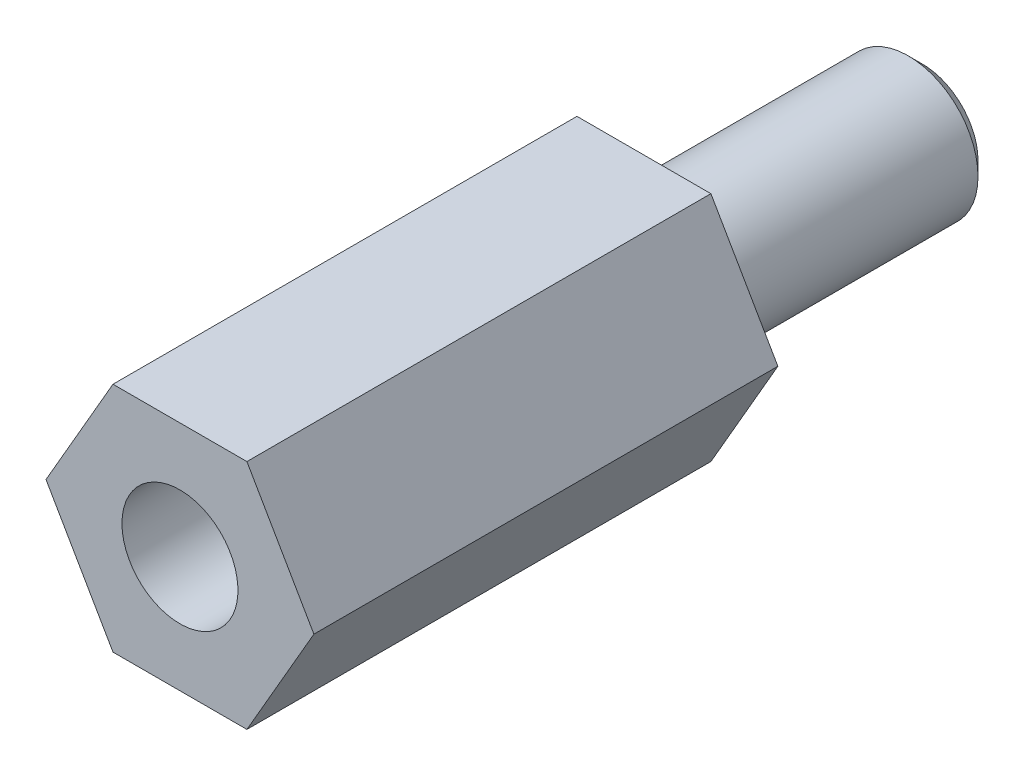
ISO-10303-21;
HEADER;
FILE_DESCRIPTION(('STEP AP214'),'2;1');
FILE_NAME('part.step','',(''),(''),'','','');
FILE_SCHEMA(('AUTOMOTIVE_DESIGN { 1 0 10303 214 1 1 1 1 }'));
ENDSEC;
DATA;
#1=APPLICATION_CONTEXT('core data for automotive mechanical design processes');
#2=APPLICATION_PROTOCOL_DEFINITION('international standard','automotive_design',2000,#1);
#3=PRODUCT_CONTEXT('',#1,'mechanical');
#4=PRODUCT('Part','Part','',(#3));
#5=PRODUCT_RELATED_PRODUCT_CATEGORY('part','',(#4));
#6=PRODUCT_DEFINITION_FORMATION('','',#4);
#7=PRODUCT_DEFINITION_CONTEXT('part definition',#1,'design');
#8=PRODUCT_DEFINITION('design','',#6,#7);
#9=PRODUCT_DEFINITION_SHAPE('','',#8);
#10=(LENGTH_UNIT() NAMED_UNIT(*) SI_UNIT(.MILLI.,.METRE.));
#11=(NAMED_UNIT(*) PLANE_ANGLE_UNIT() SI_UNIT($,.RADIAN.));
#12=(NAMED_UNIT(*) SI_UNIT($,.STERADIAN.) SOLID_ANGLE_UNIT());
#13=UNCERTAINTY_MEASURE_WITH_UNIT(LENGTH_MEASURE(1.E-05),#10,'distance_accuracy_value','');
#14=(GEOMETRIC_REPRESENTATION_CONTEXT(3) GLOBAL_UNCERTAINTY_ASSIGNED_CONTEXT((#13)) GLOBAL_UNIT_ASSIGNED_CONTEXT((#10,
#11,#12)) REPRESENTATION_CONTEXT('',''));
#15=CARTESIAN_POINT('',(0.,0.,0.));
#16=DIRECTION('',(0.,0.,1.));
#17=DIRECTION('',(1.,0.,0.));
#18=AXIS2_PLACEMENT_3D('',#15,#16,#17);
#19=CARTESIAN_POINT('',(0.,0.,-11.));
#20=DIRECTION('',(0.,0.,1.));
#21=DIRECTION('',(1.,0.,0.));
#22=AXIS2_PLACEMENT_3D('',#19,#20,#21);
#23=PLANE('',#22);
#24=CARTESIAN_POINT('',(0.,0.,-10.9999999999673));
#25=DIRECTION('',(0.,0.,1.));
#26=DIRECTION('',(1.,0.,0.));
#27=AXIS2_PLACEMENT_3D('',#24,#25,#26);
#28=CIRCLE('',#27,1.20000000003984);
#29=CARTESIAN_POINT('',(1.20000000003984,0.,-10.9999999999673));
#30=VERTEX_POINT('',#29);
#31=EDGE_CURVE('E19',#30,#30,#28,.T.);
#32=ORIENTED_EDGE('',*,*,#31,.F.);
#33=EDGE_LOOP('',(#32));
#34=FACE_BOUND('',#33,.T.);
#35=ADVANCED_FACE('F16',(#34),#23,.F.);
#36=CARTESIAN_POINT('',(0.,0.,-1.00000000009004));
#37=DIRECTION('',(0.,0.,1.));
#38=DIRECTION('',(1.,0.,0.));
#39=AXIS2_PLACEMENT_3D('',#36,#37,#38);
#40=CONICAL_SURFACE('',#39,1.24999999968622,1.02974425838754);
#41=CARTESIAN_POINT('',(1.98951966012828E-10,0.,-1.75107577382505));
#42=VERTEX_POINT('',#41);
#43=VERTEX_LOOP('',#42);
#44=FACE_BOUND('',#43,.T.);
#45=CARTESIAN_POINT('',(0.,0.,-1.));
#46=DIRECTION('',(0.,0.,-1.));
#47=DIRECTION('',(-1.,0.,0.));
#48=AXIS2_PLACEMENT_3D('',#45,#46,#47);
#49=CIRCLE('',#48,1.25);
#50=CARTESIAN_POINT('',(-1.25,0.,-1.));
#51=VERTEX_POINT('',#50);
#52=EDGE_CURVE('E79',#51,#51,#49,.F.);
#53=ORIENTED_EDGE('',*,*,#52,.T.);
#54=EDGE_LOOP('',(#53));
#55=FACE_BOUND('',#54,.T.);
#56=ADVANCED_FACE('F73',(#44,#55),#40,.F.);
#57=CARTESIAN_POINT('',(0.,0.,-10.6999999999289));
#58=DIRECTION('',(0.,0.,1.));
#59=DIRECTION('',(1.,0.,0.));
#60=AXIS2_PLACEMENT_3D('',#57,#58,#59);
#61=CONICAL_SURFACE('',#60,1.50000000007822,0.785398163397448);
#62=ORIENTED_EDGE('',*,*,#31,.T.);
#63=EDGE_LOOP('',(#62));
#64=FACE_BOUND('',#63,.T.);
#65=CARTESIAN_POINT('',(0.,0.,-10.7));
#66=DIRECTION('',(0.,0.,1.));
#67=DIRECTION('',(1.,0.,0.));
#68=AXIS2_PLACEMENT_3D('',#65,#66,#67);
#69=CIRCLE('',#68,1.5);
#70=CARTESIAN_POINT('',(1.5,0.,-10.7));
#71=VERTEX_POINT('',#70);
#72=EDGE_CURVE('E88',#71,#71,#69,.T.);
#73=ORIENTED_EDGE('',*,*,#72,.F.);
#74=EDGE_LOOP('',(#73));
#75=FACE_BOUND('',#74,.T.);
#76=ADVANCED_FACE('F76',(#64,#75),#61,.T.);
#77=CARTESIAN_POINT('',(0.,0.,5.));
#78=DIRECTION('',(0.,0.,-1.));
#79=DIRECTION('',(-1.,0.,0.));
#80=AXIS2_PLACEMENT_3D('',#77,#78,#79);
#81=CYLINDRICAL_SURFACE('',#80,1.25);
#82=CARTESIAN_POINT('',(0.,0.,5.));
#83=DIRECTION('',(0.,0.,-1.));
#84=DIRECTION('',(-1.,0.,0.));
#85=AXIS2_PLACEMENT_3D('',#82,#83,#84);
#86=CIRCLE('',#85,1.25);
#87=CARTESIAN_POINT('',(-1.25,0.,5.));
#88=VERTEX_POINT('',#87);
#89=EDGE_CURVE('E93',#88,#88,#86,.T.);
#90=ORIENTED_EDGE('',*,*,#89,.F.);
#91=EDGE_LOOP('',(#90));
#92=FACE_BOUND('',#91,.T.);
#93=ORIENTED_EDGE('',*,*,#52,.F.);
#94=EDGE_LOOP('',(#93));
#95=FACE_BOUND('',#94,.T.);
#96=ADVANCED_FACE('F128',(#92,#95),#81,.F.);
#97=CARTESIAN_POINT('',(2.88675134594813,0.,5.));
#98=DIRECTION('',(-0.866025403784439,-0.5,0.));
#99=DIRECTION('',(0.5,-0.866025403784439,0.));
#100=AXIS2_PLACEMENT_3D('',#97,#98,#99);
#101=PLANE('',#100);
#102=DIRECTION('',(0.,0.,1.));
#103=VECTOR('',#102,1.);
#104=CARTESIAN_POINT('',(1.44337567297406,2.5,5.));
#105=LINE('',#104,#103);
#106=CARTESIAN_POINT('',(1.44337567297406,2.5,-5.));
#107=VERTEX_POINT('',#106);
#108=CARTESIAN_POINT('',(1.44337567297406,2.5,5.));
#109=VERTEX_POINT('',#108);
#110=EDGE_CURVE('E81',#107,#109,#105,.T.);
#111=ORIENTED_EDGE('',*,*,#110,.T.);
#112=DIRECTION('',(-0.5,0.866025403784439,0.));
#113=VECTOR('',#112,1.);
#114=CARTESIAN_POINT('',(2.88675134594813,0.,5.));
#115=LINE('',#114,#113);
#116=CARTESIAN_POINT('',(2.88675134594813,0.,5.));
#117=VERTEX_POINT('',#116);
#118=EDGE_CURVE('E108',#117,#109,#115,.T.);
#119=ORIENTED_EDGE('',*,*,#118,.F.);
#120=DIRECTION('',(0.,0.,1.));
#121=VECTOR('',#120,1.);
#122=CARTESIAN_POINT('',(2.88675134594813,0.,5.));
#123=LINE('',#122,#121);
#124=CARTESIAN_POINT('',(2.88675134594813,0.,-5.));
#125=VERTEX_POINT('',#124);
#126=EDGE_CURVE('E69',#117,#125,#123,.F.);
#127=ORIENTED_EDGE('',*,*,#126,.T.);
#128=DIRECTION('',(-0.5,0.866025403784439,0.));
#129=VECTOR('',#128,1.);
#130=CARTESIAN_POINT('',(2.88675134594813,0.,-5.));
#131=LINE('',#130,#129);
#132=EDGE_CURVE('E174',#125,#107,#131,.T.);
#133=ORIENTED_EDGE('',*,*,#132,.T.);
#134=EDGE_LOOP('',(#111,#119,#127,#133));
#135=FACE_BOUND('',#134,.T.);
#136=ADVANCED_FACE('F135',(#135),#101,.F.);
#137=CARTESIAN_POINT('',(1.44337567297406,2.5,5.));
#138=DIRECTION('',(0.,-1.,0.));
#139=DIRECTION('',(1.,0.,0.));
#140=AXIS2_PLACEMENT_3D('',#137,#138,#139);
#141=PLANE('',#140);
#142=DIRECTION('',(0.,0.,1.));
#143=VECTOR('',#142,1.);
#144=CARTESIAN_POINT('',(-1.44337567297406,2.5,5.));
#145=LINE('',#144,#143);
#146=CARTESIAN_POINT('',(-1.44337567297406,2.5,-5.));
#147=VERTEX_POINT('',#146);
#148=CARTESIAN_POINT('',(-1.44337567297406,2.5,5.));
#149=VERTEX_POINT('',#148);
#150=EDGE_CURVE('E115',#147,#149,#145,.T.);
#151=ORIENTED_EDGE('',*,*,#150,.T.);
#152=DIRECTION('',(1.,0.,0.));
#153=VECTOR('',#152,1.);
#154=CARTESIAN_POINT('',(4.33012701892219,2.5,5.));
#155=LINE('',#154,#153);
#156=EDGE_CURVE('E102',#109,#149,#155,.F.);
#157=ORIENTED_EDGE('',*,*,#156,.F.);
#158=ORIENTED_EDGE('',*,*,#110,.F.);
#159=DIRECTION('',(1.,0.,0.));
#160=VECTOR('',#159,1.);
#161=CARTESIAN_POINT('',(4.33012701892219,2.5,-5.));
#162=LINE('',#161,#160);
#163=EDGE_CURVE('E179',#107,#147,#162,.F.);
#164=ORIENTED_EDGE('',*,*,#163,.T.);
#165=EDGE_LOOP('',(#151,#157,#158,#164));
#166=FACE_BOUND('',#165,.T.);
#167=ADVANCED_FACE('F166',(#166),#141,.F.);
#168=CARTESIAN_POINT('',(1.44337567297406,-2.5,5.));
#169=DIRECTION('',(-0.866025403784439,0.5,0.));
#170=DIRECTION('',(-0.5,-0.866025403784439,0.));
#171=AXIS2_PLACEMENT_3D('',#168,#169,#170);
#172=PLANE('',#171);
#173=ORIENTED_EDGE('',*,*,#126,.F.);
#174=DIRECTION('',(0.5,0.866025403784439,0.));
#175=VECTOR('',#174,1.);
#176=CARTESIAN_POINT('',(1.44337567297406,-2.5,5.));
#177=LINE('',#176,#175);
#178=CARTESIAN_POINT('',(1.44337567297406,-2.5,5.));
#179=VERTEX_POINT('',#178);
#180=EDGE_CURVE('E113',#179,#117,#177,.T.);
#181=ORIENTED_EDGE('',*,*,#180,.F.);
#182=DIRECTION('',(0.,0.,1.));
#183=VECTOR('',#182,1.);
#184=CARTESIAN_POINT('',(1.44337567297406,-2.5,5.));
#185=LINE('',#184,#183);
#186=CARTESIAN_POINT('',(1.44337567297406,-2.5,-5.));
#187=VERTEX_POINT('',#186);
#188=EDGE_CURVE('E100',#179,#187,#185,.F.);
#189=ORIENTED_EDGE('',*,*,#188,.T.);
#190=DIRECTION('',(0.5,0.866025403784439,0.));
#191=VECTOR('',#190,1.);
#192=CARTESIAN_POINT('',(1.44337567297406,-2.5,-5.));
#193=LINE('',#192,#191);
#194=EDGE_CURVE('E92',#187,#125,#193,.T.);
#195=ORIENTED_EDGE('',*,*,#194,.T.);
#196=EDGE_LOOP('',(#173,#181,#189,#195));
#197=FACE_BOUND('',#196,.T.);
#198=ADVANCED_FACE('F163',(#197),#172,.F.);
#199=CARTESIAN_POINT('',(0.,0.,0.));
#200=DIRECTION('',(0.,0.,1.));
#201=DIRECTION('',(1.,0.,0.));
#202=AXIS2_PLACEMENT_3D('',#199,#200,#201);
#203=CYLINDRICAL_SURFACE('',#202,1.5);
#204=ORIENTED_EDGE('',*,*,#72,.T.);
#205=EDGE_LOOP('',(#204));
#206=FACE_BOUND('',#205,.T.);
#207=CARTESIAN_POINT('',(0.,0.,-5.));
#208=DIRECTION('',(0.,0.,1.));
#209=DIRECTION('',(1.,0.,0.));
#210=AXIS2_PLACEMENT_3D('',#207,#208,#209);
#211=CIRCLE('',#210,1.5);
#212=CARTESIAN_POINT('',(1.5,0.,-5.));
#213=VERTEX_POINT('',#212);
#214=EDGE_CURVE('E89',#213,#213,#211,.F.);
#215=ORIENTED_EDGE('',*,*,#214,.T.);
#216=EDGE_LOOP('',(#215));
#217=FACE_BOUND('',#216,.T.);
#218=ADVANCED_FACE('F124',(#206,#217),#203,.T.);
#219=CARTESIAN_POINT('',(-1.44337567297406,2.5,5.));
#220=DIRECTION('',(0.866025403784439,-0.5,0.));
#221=DIRECTION('',(0.5,0.866025403784439,0.));
#222=AXIS2_PLACEMENT_3D('',#219,#220,#221);
#223=PLANE('',#222);
#224=DIRECTION('',(0.,0.,1.));
#225=VECTOR('',#224,1.);
#226=CARTESIAN_POINT('',(-2.88675134594813,0.,5.));
#227=LINE('',#226,#225);
#228=CARTESIAN_POINT('',(-2.88675134594813,0.,-5.));
#229=VERTEX_POINT('',#228);
#230=CARTESIAN_POINT('',(-2.88675134594813,0.,5.));
#231=VERTEX_POINT('',#230);
#232=EDGE_CURVE('E91',#229,#231,#227,.T.);
#233=ORIENTED_EDGE('',*,*,#232,.T.);
#234=DIRECTION('',(-0.5,-0.866025403784439,0.));
#235=VECTOR('',#234,1.);
#236=CARTESIAN_POINT('',(-1.44337567297406,2.5,5.));
#237=LINE('',#236,#235);
#238=EDGE_CURVE('E96',#149,#231,#237,.T.);
#239=ORIENTED_EDGE('',*,*,#238,.F.);
#240=ORIENTED_EDGE('',*,*,#150,.F.);
#241=DIRECTION('',(-0.5,-0.866025403784439,0.));
#242=VECTOR('',#241,1.);
#243=CARTESIAN_POINT('',(-1.44337567297406,2.5,-5.));
#244=LINE('',#243,#242);
#245=EDGE_CURVE('E183',#147,#229,#244,.T.);
#246=ORIENTED_EDGE('',*,*,#245,.T.);
#247=EDGE_LOOP('',(#233,#239,#240,#246));
#248=FACE_BOUND('',#247,.T.);
#249=ADVANCED_FACE('F157',(#248),#223,.F.);
#250=CARTESIAN_POINT('',(4.33012701892219,2.5,5.));
#251=DIRECTION('',(0.,0.,1.));
#252=DIRECTION('',(1.,0.,0.));
#253=AXIS2_PLACEMENT_3D('',#250,#251,#252);
#254=PLANE('',#253);
#255=ORIENTED_EDGE('',*,*,#89,.T.);
#256=EDGE_LOOP('',(#255));
#257=FACE_BOUND('',#256,.T.);
#258=DIRECTION('',(-0.499999999999999,0.866025403784439,0.));
#259=VECTOR('',#258,1.);
#260=CARTESIAN_POINT('',(-2.88675134594813,0.,5.));
#261=LINE('',#260,#259);
#262=CARTESIAN_POINT('',(-1.44337567297406,-2.5,5.));
#263=VERTEX_POINT('',#262);
#264=EDGE_CURVE('E190',#231,#263,#261,.F.);
#265=ORIENTED_EDGE('',*,*,#264,.T.);
#266=DIRECTION('',(-1.,0.,0.));
#267=VECTOR('',#266,1.);
#268=CARTESIAN_POINT('',(-1.44337567297406,-2.5,5.));
#269=LINE('',#268,#267);
#270=EDGE_CURVE('E95',#263,#179,#269,.F.);
#271=ORIENTED_EDGE('',*,*,#270,.T.);
#272=ORIENTED_EDGE('',*,*,#180,.T.);
#273=ORIENTED_EDGE('',*,*,#118,.T.);
#274=ORIENTED_EDGE('',*,*,#156,.T.);
#275=ORIENTED_EDGE('',*,*,#238,.T.);
#276=EDGE_LOOP('',(#265,#271,#272,#273,#274,#275));
#277=FACE_BOUND('',#276,.T.);
#278=ADVANCED_FACE('F153',(#257,#277),#254,.T.);
#279=CARTESIAN_POINT('',(-1.44337567297406,-2.5,5.));
#280=DIRECTION('',(0.,1.,0.));
#281=DIRECTION('',(-1.,0.,0.));
#282=AXIS2_PLACEMENT_3D('',#279,#280,#281);
#283=PLANE('',#282);
#284=ORIENTED_EDGE('',*,*,#188,.F.);
#285=ORIENTED_EDGE('',*,*,#270,.F.);
#286=DIRECTION('',(0.,0.,1.));
#287=VECTOR('',#286,1.);
#288=CARTESIAN_POINT('',(-1.44337567297406,-2.5,5.));
#289=LINE('',#288,#287);
#290=CARTESIAN_POINT('',(-1.44337567297406,-2.5,-5.));
#291=VERTEX_POINT('',#290);
#292=EDGE_CURVE('E25',#263,#291,#289,.F.);
#293=ORIENTED_EDGE('',*,*,#292,.T.);
#294=DIRECTION('',(1.,0.,0.));
#295=VECTOR('',#294,1.);
#296=CARTESIAN_POINT('',(4.33012701892219,-2.5,-5.));
#297=LINE('',#296,#295);
#298=EDGE_CURVE('E33',#291,#187,#297,.T.);
#299=ORIENTED_EDGE('',*,*,#298,.T.);
#300=EDGE_LOOP('',(#284,#285,#293,#299));
#301=FACE_BOUND('',#300,.T.);
#302=ADVANCED_FACE('F146',(#301),#283,.F.);
#303=CARTESIAN_POINT('',(4.33012701892219,2.5,-5.));
#304=DIRECTION('',(0.,0.,1.));
#305=DIRECTION('',(1.,0.,0.));
#306=AXIS2_PLACEMENT_3D('',#303,#304,#305);
#307=PLANE('',#306);
#308=ORIENTED_EDGE('',*,*,#214,.F.);
#309=EDGE_LOOP('',(#308));
#310=FACE_BOUND('',#309,.T.);
#311=ORIENTED_EDGE('',*,*,#298,.F.);
#312=DIRECTION('',(-0.499999999999999,0.866025403784439,0.));
#313=VECTOR('',#312,1.);
#314=CARTESIAN_POINT('',(-2.88675134594813,0.,-5.));
#315=LINE('',#314,#313);
#316=EDGE_CURVE('E11',#291,#229,#315,.T.);
#317=ORIENTED_EDGE('',*,*,#316,.T.);
#318=ORIENTED_EDGE('',*,*,#245,.F.);
#319=ORIENTED_EDGE('',*,*,#163,.F.);
#320=ORIENTED_EDGE('',*,*,#132,.F.);
#321=ORIENTED_EDGE('',*,*,#194,.F.);
#322=EDGE_LOOP('',(#311,#317,#318,#319,#320,#321));
#323=FACE_BOUND('',#322,.T.);
#324=ADVANCED_FACE('F140',(#310,#323),#307,.F.);
#325=CARTESIAN_POINT('',(-2.88675134594813,0.,5.));
#326=DIRECTION('',(0.866025403784439,0.499999999999999,0.));
#327=DIRECTION('',(-0.499999999999999,0.866025403784439,0.));
#328=AXIS2_PLACEMENT_3D('',#325,#326,#327);
#329=PLANE('',#328);
#330=ORIENTED_EDGE('',*,*,#292,.F.);
#331=ORIENTED_EDGE('',*,*,#264,.F.);
#332=ORIENTED_EDGE('',*,*,#232,.F.);
#333=ORIENTED_EDGE('',*,*,#316,.F.);
#334=EDGE_LOOP('',(#330,#331,#332,#333));
#335=FACE_BOUND('',#334,.T.);
#336=ADVANCED_FACE('F138',(#335),#329,.F.);
#337=CLOSED_SHELL('',(#35,#56,#76,#96,#136,#167,#198,#218,#249,#278,#302,#324,#336));
#338=MANIFOLD_SOLID_BREP('B1',#337);
#339=ADVANCED_BREP_SHAPE_REPRESENTATION('',(#18,#338),#14);
#340=SHAPE_DEFINITION_REPRESENTATION(#9,#339);
ENDSEC;
END-ISO-10303-21;
